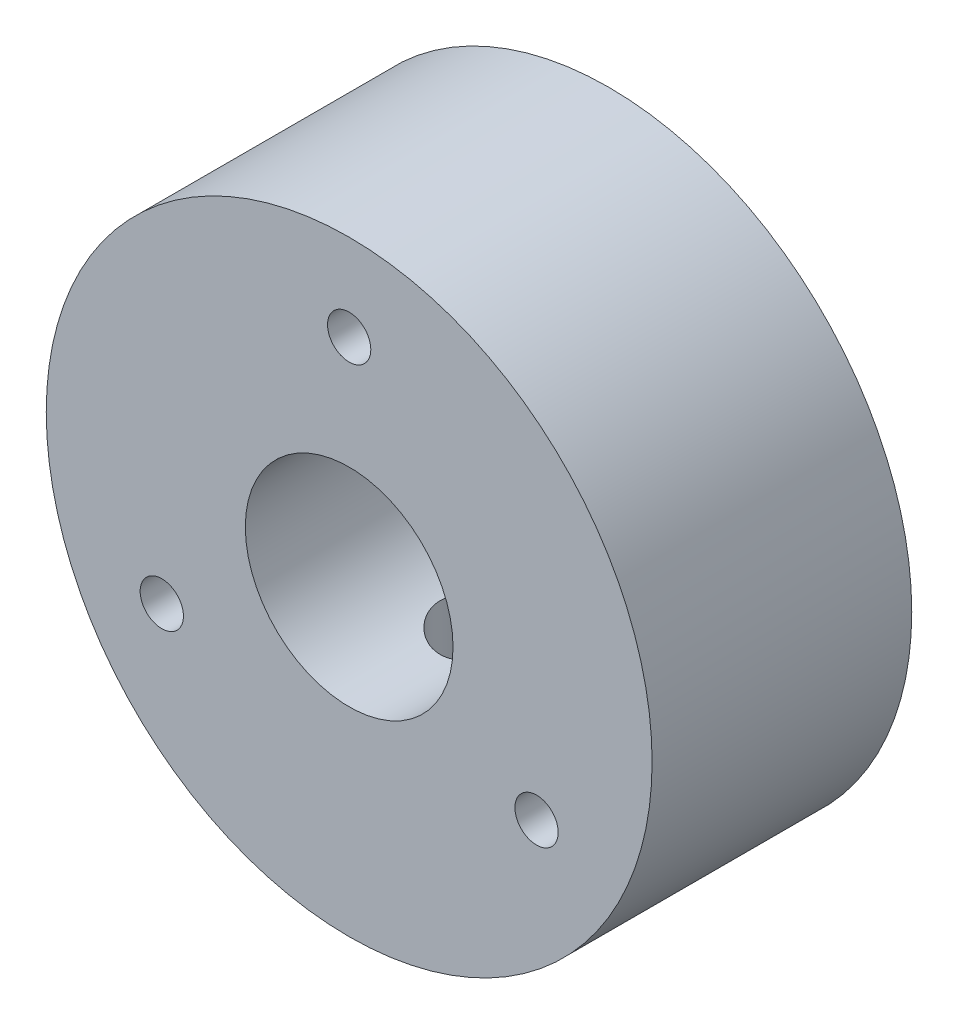
ISO-10303-21;
HEADER;
FILE_DESCRIPTION(('STEP AP214'),'2;1');
FILE_NAME('part.step','',(''),(''),'','','');
FILE_SCHEMA(('AUTOMOTIVE_DESIGN { 1 0 10303 214 1 1 1 1 }'));
ENDSEC;
DATA;
#1=APPLICATION_CONTEXT('core data for automotive mechanical design processes');
#2=APPLICATION_PROTOCOL_DEFINITION('international standard','automotive_design',2000,#1);
#3=PRODUCT_CONTEXT('',#1,'mechanical');
#4=PRODUCT('Part','Part','',(#3));
#5=PRODUCT_RELATED_PRODUCT_CATEGORY('part','',(#4));
#6=PRODUCT_DEFINITION_FORMATION('','',#4);
#7=PRODUCT_DEFINITION_CONTEXT('part definition',#1,'design');
#8=PRODUCT_DEFINITION('design','',#6,#7);
#9=PRODUCT_DEFINITION_SHAPE('','',#8);
#10=(LENGTH_UNIT() NAMED_UNIT(*) SI_UNIT(.MILLI.,.METRE.));
#11=(NAMED_UNIT(*) PLANE_ANGLE_UNIT() SI_UNIT($,.RADIAN.));
#12=(NAMED_UNIT(*) SI_UNIT($,.STERADIAN.) SOLID_ANGLE_UNIT());
#13=UNCERTAINTY_MEASURE_WITH_UNIT(LENGTH_MEASURE(1.E-05),#10,'distance_accuracy_value','');
#14=(GEOMETRIC_REPRESENTATION_CONTEXT(3) GLOBAL_UNCERTAINTY_ASSIGNED_CONTEXT((#13)) GLOBAL_UNIT_ASSIGNED_CONTEXT((#10,
#11,#12)) REPRESENTATION_CONTEXT('',''));
#15=CARTESIAN_POINT('',(0.,0.,0.));
#16=DIRECTION('',(0.,0.,1.));
#17=DIRECTION('',(1.,0.,0.));
#18=AXIS2_PLACEMENT_3D('',#15,#16,#17);
#19=CARTESIAN_POINT('',(0.,0.,15.));
#20=DIRECTION('',(0.,0.,1.));
#21=DIRECTION('',(1.,0.,0.));
#22=AXIS2_PLACEMENT_3D('',#19,#20,#21);
#23=PLANE('',#22);
#24=CARTESIAN_POINT('',(-10.8253175473055,-6.25000000000005,15.));
#25=DIRECTION('',(0.,0.,1.));
#26=DIRECTION('',(1.,0.,0.));
#27=AXIS2_PLACEMENT_3D('',#24,#25,#26);
#28=CIRCLE('',#27,1.25);
#29=CARTESIAN_POINT('',(-9.57531754730546,-6.25000000000005,15.));
#30=VERTEX_POINT('',#29);
#31=EDGE_CURVE('E111',#30,#30,#28,.T.);
#32=ORIENTED_EDGE('',*,*,#31,.F.);
#33=EDGE_LOOP('',(#32));
#34=FACE_BOUND('',#33,.T.);
#35=CARTESIAN_POINT('',(10.8253175473055,-6.25000000000005,15.));
#36=DIRECTION('',(0.,0.,1.));
#37=DIRECTION('',(1.,0.,0.));
#38=AXIS2_PLACEMENT_3D('',#35,#36,#37);
#39=CIRCLE('',#38,1.25);
#40=CARTESIAN_POINT('',(12.0753175473055,-6.25000000000005,15.));
#41=VERTEX_POINT('',#40);
#42=EDGE_CURVE('E107',#41,#41,#39,.T.);
#43=ORIENTED_EDGE('',*,*,#42,.F.);
#44=EDGE_LOOP('',(#43));
#45=FACE_BOUND('',#44,.T.);
#46=CARTESIAN_POINT('',(0.,12.5,15.));
#47=DIRECTION('',(0.,0.,1.));
#48=DIRECTION('',(1.,0.,0.));
#49=AXIS2_PLACEMENT_3D('',#46,#47,#48);
#50=CIRCLE('',#49,1.25);
#51=CARTESIAN_POINT('',(1.25,12.5,15.));
#52=VERTEX_POINT('',#51);
#53=EDGE_CURVE('E62',#52,#52,#50,.T.);
#54=ORIENTED_EDGE('',*,*,#53,.F.);
#55=EDGE_LOOP('',(#54));
#56=FACE_BOUND('',#55,.T.);
#57=CARTESIAN_POINT('',(0.,0.,15.));
#58=DIRECTION('',(0.,0.,1.));
#59=DIRECTION('',(1.,0.,0.));
#60=AXIS2_PLACEMENT_3D('',#57,#58,#59);
#61=CIRCLE('',#60,17.5);
#62=CARTESIAN_POINT('',(17.5,0.,15.));
#63=VERTEX_POINT('',#62);
#64=EDGE_CURVE('E10',#63,#63,#61,.T.);
#65=ORIENTED_EDGE('',*,*,#64,.T.);
#66=EDGE_LOOP('',(#65));
#67=FACE_BOUND('',#66,.T.);
#68=CARTESIAN_POINT('',(0.,0.,15.));
#69=DIRECTION('',(0.,0.,1.));
#70=DIRECTION('',(1.,0.,0.));
#71=AXIS2_PLACEMENT_3D('',#68,#69,#70);
#72=CIRCLE('',#71,6.);
#73=CARTESIAN_POINT('',(6.,0.,15.));
#74=VERTEX_POINT('',#73);
#75=EDGE_CURVE('E50',#74,#74,#72,.T.);
#76=ORIENTED_EDGE('',*,*,#75,.F.);
#77=EDGE_LOOP('',(#76));
#78=FACE_BOUND('',#77,.T.);
#79=ADVANCED_FACE('F32',(#34,#45,#56,#67,#78),#23,.T.);
#80=CARTESIAN_POINT('',(0.,0.,0.));
#81=DIRECTION('',(0.,0.,1.));
#82=DIRECTION('',(1.,0.,0.));
#83=AXIS2_PLACEMENT_3D('',#80,#81,#82);
#84=PLANE('',#83);
#85=CARTESIAN_POINT('',(-10.8253175473055,-6.25000000000005,0.));
#86=DIRECTION('',(0.,0.,1.));
#87=DIRECTION('',(1.,0.,0.));
#88=AXIS2_PLACEMENT_3D('',#85,#86,#87);
#89=CIRCLE('',#88,1.25);
#90=CARTESIAN_POINT('',(-9.57531754730546,-6.25000000000005,0.));
#91=VERTEX_POINT('',#90);
#92=EDGE_CURVE('E89',#91,#91,#89,.T.);
#93=ORIENTED_EDGE('',*,*,#92,.T.);
#94=EDGE_LOOP('',(#93));
#95=FACE_BOUND('',#94,.T.);
#96=CARTESIAN_POINT('',(10.8253175473055,-6.25000000000005,0.));
#97=DIRECTION('',(0.,0.,1.));
#98=DIRECTION('',(1.,0.,0.));
#99=AXIS2_PLACEMENT_3D('',#96,#97,#98);
#100=CIRCLE('',#99,1.25);
#101=CARTESIAN_POINT('',(12.0753175473055,-6.25000000000005,0.));
#102=VERTEX_POINT('',#101);
#103=EDGE_CURVE('E93',#102,#102,#100,.T.);
#104=ORIENTED_EDGE('',*,*,#103,.T.);
#105=EDGE_LOOP('',(#104));
#106=FACE_BOUND('',#105,.T.);
#107=CARTESIAN_POINT('',(0.,12.5,0.));
#108=DIRECTION('',(0.,0.,1.));
#109=DIRECTION('',(1.,0.,0.));
#110=AXIS2_PLACEMENT_3D('',#107,#108,#109);
#111=CIRCLE('',#110,1.25);
#112=CARTESIAN_POINT('',(1.25,12.5,0.));
#113=VERTEX_POINT('',#112);
#114=EDGE_CURVE('E97',#113,#113,#111,.T.);
#115=ORIENTED_EDGE('',*,*,#114,.T.);
#116=EDGE_LOOP('',(#115));
#117=FACE_BOUND('',#116,.T.);
#118=CARTESIAN_POINT('',(0.,0.,0.));
#119=DIRECTION('',(0.,0.,1.));
#120=DIRECTION('',(1.,0.,0.));
#121=AXIS2_PLACEMENT_3D('',#118,#119,#120);
#122=CIRCLE('',#121,17.5);
#123=CARTESIAN_POINT('',(17.5,0.,0.));
#124=VERTEX_POINT('',#123);
#125=EDGE_CURVE('E45',#124,#124,#122,.T.);
#126=ORIENTED_EDGE('',*,*,#125,.F.);
#127=EDGE_LOOP('',(#126));
#128=FACE_BOUND('',#127,.T.);
#129=CARTESIAN_POINT('',(0.,0.,0.));
#130=DIRECTION('',(0.,0.,1.));
#131=DIRECTION('',(1.,0.,0.));
#132=AXIS2_PLACEMENT_3D('',#129,#130,#131);
#133=CIRCLE('',#132,6.);
#134=CARTESIAN_POINT('',(6.,0.,0.));
#135=VERTEX_POINT('',#134);
#136=EDGE_CURVE('E52',#135,#135,#133,.T.);
#137=ORIENTED_EDGE('',*,*,#136,.T.);
#138=EDGE_LOOP('',(#137));
#139=FACE_BOUND('',#138,.T.);
#140=ADVANCED_FACE('F78',(#95,#106,#117,#128,#139),#84,.F.);
#141=CARTESIAN_POINT('',(0.,0.,15.));
#142=DIRECTION('',(0.,0.,-1.));
#143=DIRECTION('',(-1.,0.,0.));
#144=AXIS2_PLACEMENT_3D('',#141,#142,#143);
#145=CYLINDRICAL_SURFACE('',#144,17.5);
#146=CARTESIAN_POINT('',(0.,-17.5,9.75));
#147=CARTESIAN_POINT('',(0.125826663936366,-17.4999982039746,9.74999467313289));
#148=CARTESIAN_POINT('',(0.251731216440566,-17.4986286238282,9.73940950656838));
#149=CARTESIAN_POINT('',(0.500034753044219,-17.4932968449871,9.69735147156739));
#150=CARTESIAN_POINT('',(0.622429972446625,-17.4893319633254,9.66585698704675));
#151=CARTESIAN_POINT('',(0.860084357918169,-17.4792561017121,9.58292534146376));
#152=CARTESIAN_POINT('',(0.975348343355449,-17.4731465901793,9.53150182322499));
#153=CARTESIAN_POINT('',(1.19558918170756,-17.4594603874971,9.41020215621672));
#154=CARTESIAN_POINT('',(1.30056775056614,-17.4518839417102,9.34032909264626));
#155=CARTESIAN_POINT('',(1.49788912137822,-17.436060101576,9.1836799241711));
#156=CARTESIAN_POINT('',(1.59016353539961,-17.4278094299233,9.09681799746965));
#157=CARTESIAN_POINT('',(1.75886814148906,-17.411593361226,8.90884113611375));
#158=CARTESIAN_POINT('',(1.83529751303625,-17.4036279789724,8.80772546379755));
#159=CARTESIAN_POINT('',(1.97039882112328,-17.3888521797531,8.59366488477999));
#160=CARTESIAN_POINT('',(2.02900639424164,-17.3820459872199,8.48067903927697));
#161=CARTESIAN_POINT('',(2.12638937605627,-17.3704026461082,8.24636641244742));
#162=CARTESIAN_POINT('',(2.16516557959415,-17.3655654186153,8.12503996563344));
#163=CARTESIAN_POINT('',(2.2215766532938,-17.3584391389484,7.87820131927238));
#164=CARTESIAN_POINT('',(2.23932723266545,-17.3561361452853,7.75271597279249));
#165=CARTESIAN_POINT('',(2.25354128293598,-17.3542964728331,7.50052798394896));
#166=CARTESIAN_POINT('',(2.25000565786455,-17.354759676563,7.37382539351011));
#167=CARTESIAN_POINT('',(2.2218425893275,-17.3583873045897,7.12360737624315));
#168=CARTESIAN_POINT('',(2.1973427893762,-17.3615353812536,7.00007731186237));
#169=CARTESIAN_POINT('',(2.12814607218483,-17.3701525439387,6.75889645611996));
#170=CARTESIAN_POINT('',(2.08344872409567,-17.3756216794719,6.64124579023567));
#171=CARTESIAN_POINT('',(1.97498909627775,-17.3882831989435,6.41476794546454));
#172=CARTESIAN_POINT('',(1.91117153394893,-17.3954805676052,6.30596753131592));
#173=CARTESIAN_POINT('',(1.76632254764974,-17.4107837721729,6.10057198509021));
#174=CARTESIAN_POINT('',(1.68529029094895,-17.4188896520175,6.00397744381127));
#175=CARTESIAN_POINT('',(1.50760560937748,-17.4351691635329,5.82499486766366));
#176=CARTESIAN_POINT('',(1.41084319849627,-17.4433428568559,5.74271598750824));
#177=CARTESIAN_POINT('',(1.20482312504764,-17.4587815726166,5.59555085947799));
#178=CARTESIAN_POINT('',(1.09556543075004,-17.4660465927467,5.53066465577105));
#179=CARTESIAN_POINT('',(0.86757066076063,-17.4788542752852,5.42012595379627));
#180=CARTESIAN_POINT('',(0.748830132356868,-17.4843963067247,5.37448049943663));
#181=CARTESIAN_POINT('',(0.505282627641302,-17.493127922252,5.30380673993336));
#182=CARTESIAN_POINT('',(0.380475952227639,-17.4963176228956,5.27877741327418));
#183=CARTESIAN_POINT('',(0.129282531728022,-17.4999699961471,5.25018835711036));
#184=CARTESIAN_POINT('',(0.00291316244096512,-17.5004517623405,5.2464783017411));
#185=CARTESIAN_POINT('',(-0.248645576148053,-17.4986855924701,5.26023608738568));
#186=CARTESIAN_POINT('',(-0.373834972006372,-17.4964377179879,5.27770345063033));
#187=CARTESIAN_POINT('',(-0.619034977216093,-17.4894767245035,5.33319533754241));
#188=CARTESIAN_POINT('',(-0.739062120422699,-17.484772227773,5.37114797740577));
#189=CARTESIAN_POINT('',(-0.971048317067566,-17.4734245548944,5.46645820512669));
#190=CARTESIAN_POINT('',(-1.08300708201003,-17.4667813094664,5.52381648644209));
#191=CARTESIAN_POINT('',(-1.2963484276738,-17.4522488584435,5.65667204944307));
#192=CARTESIAN_POINT('',(-1.39767015153902,-17.4443530705122,5.7322663234421));
#193=CARTESIAN_POINT('',(-1.58624160153369,-17.4282188257375,5.899311100636));
#194=CARTESIAN_POINT('',(-1.6734907351305,-17.4199803544836,5.99076227115628));
#195=CARTESIAN_POINT('',(-1.83197548670832,-17.4040301413668,6.18758801091373));
#196=CARTESIAN_POINT('',(-1.90311130479669,-17.3963218776594,6.29304326253017));
#197=CARTESIAN_POINT('',(-2.02666012522735,-17.3823626363457,6.51449316700576));
#198=CARTESIAN_POINT('',(-2.07907352108845,-17.3761116281109,6.63048759828198));
#199=CARTESIAN_POINT('',(-2.16352900434716,-17.3657985633946,6.86940442651756));
#200=CARTESIAN_POINT('',(-2.19562686267363,-17.3617305188836,6.9923068392753));
#201=CARTESIAN_POINT('',(-2.23871947697181,-17.3562269753765,7.24181292188494));
#202=CARTESIAN_POINT('',(-2.24971527632875,-17.3547913462215,7.36841640842404));
#203=CARTESIAN_POINT('',(-2.25027174771641,-17.3547191199926,7.6207377348031));
#204=CARTESIAN_POINT('',(-2.2399892216588,-17.3560620474708,7.74645525168402));
#205=CARTESIAN_POINT('',(-2.19861349491162,-17.3613515363724,7.9943591140357));
#206=CARTESIAN_POINT('',(-2.16752029608453,-17.3652980975629,8.11654545982249));
#207=CARTESIAN_POINT('',(-2.08545574484551,-17.3753437330908,8.35389488133668));
#208=CARTESIAN_POINT('',(-2.03449240218651,-17.3814419399952,8.46906076544312));
#209=CARTESIAN_POINT('',(-1.91414964020136,-17.395105129023,8.68923162001525));
#210=CARTESIAN_POINT('',(-1.84476993740489,-17.4026701337232,8.79423643404464));
#211=CARTESIAN_POINT('',(-1.68898364486348,-17.418481278622,8.99190541591187));
#212=CARTESIAN_POINT('',(-1.60246026563941,-17.4267318519225,9.08447719241467));
#213=CARTESIAN_POINT('',(-1.41508708000806,-17.4429456345148,9.25384694055298));
#214=CARTESIAN_POINT('',(-1.31423390790498,-17.4509087757437,9.3306411960649));
#215=CARTESIAN_POINT('',(-1.10059707139096,-17.4656860103068,9.46654086974623));
#216=CARTESIAN_POINT('',(-0.987767090375414,-17.4724953573241,9.52557396105329));
#217=CARTESIAN_POINT('',(-0.753769111421519,-17.4841499591708,9.62376956694677));
#218=CARTESIAN_POINT('',(-0.632610279401129,-17.4889973339223,9.66295354019952));
#219=CARTESIAN_POINT('',(-0.425695928028328,-17.4950214329663,9.71102336497211));
#220=CARTESIAN_POINT('',(-0.34124186068432,-17.4968792358005,9.72561842400604));
#221=CARTESIAN_POINT('',(-0.17120387768221,-17.4993691254953,9.74510851523243));
#222=CARTESIAN_POINT('',(-0.085619971032625,-17.5000012221229,9.75000362471827));
#223=CARTESIAN_POINT('',(0.,-17.5,9.75));
#224=B_SPLINE_CURVE_WITH_KNOTS('',3,(#146,#147,#148,#149,#150,#151,#152,#153,#154,#155,#156,
#157,#158,#159,#160,#161,#162,#163,#164,#165,#166,#167,#168,#169,#170,#171,#172,#173,#174,#175,
#176,#177,#178,#179,#180,#181,#182,#183,#184,#185,#186,#187,#188,#189,#190,#191,#192,#193,#194,
#195,#196,#197,#198,#199,#200,#201,#202,#203,#204,#205,#206,#207,#208,#209,#210,#211,#212,#213,
#214,#215,#216,#217,#218,#219,#220,#221,#222,#223),.UNSPECIFIED.,.T.,.F.,(4,2,2,2,2,2,2,2,2,2,2,
2,2,2,2,2,2,2,2,2,2,2,2,2,2,2,2,2,2,2,2,2,2,2,2,2,2,2,4),(0.,0.377167233438936,
0.754724991353796,1.13202473972153,1.50926143458825,1.88845545438443,2.26766910549003,
2.6482364518246,3.02878854381839,3.40723648686338,3.78566835725604,4.16181235141834,
4.53796436977003,4.91521463413526,5.29248315147272,5.67251296808475,6.05254374975542,
6.43271353754735,6.81286448704356,7.19033160575359,7.56779020884563,7.94393282192944,
8.32008887783585,8.69829151453845,9.07651007147552,9.45701074759483,9.8375034256575,
10.2169469787706,10.5963717699229,10.9730105043799,11.3496492051289,11.7261362376708,
12.1026290655542,12.4817808194563,12.8610217739104,13.2417867945198,13.6221392909514,
13.878788429689,14.1354355233275),.UNSPECIFIED.);
#225=CARTESIAN_POINT('',(0.,-17.5,9.75));
#226=VERTEX_POINT('',#225);
#227=EDGE_CURVE('E55',#226,#226,#224,.T.);
#228=ORIENTED_EDGE('',*,*,#227,.T.);
#229=EDGE_LOOP('',(#228));
#230=FACE_BOUND('',#229,.T.);
#231=ORIENTED_EDGE('',*,*,#64,.F.);
#232=EDGE_LOOP('',(#231));
#233=FACE_BOUND('',#232,.T.);
#234=ORIENTED_EDGE('',*,*,#125,.T.);
#235=EDGE_LOOP('',(#234));
#236=FACE_BOUND('',#235,.T.);
#237=ADVANCED_FACE('F34',(#230,#233,#236),#145,.T.);
#238=CARTESIAN_POINT('',(0.,0.,15.));
#239=DIRECTION('',(0.,0.,-1.));
#240=DIRECTION('',(-1.,0.,0.));
#241=AXIS2_PLACEMENT_3D('',#238,#239,#240);
#242=CYLINDRICAL_SURFACE('',#241,6.);
#243=CARTESIAN_POINT('',(0.,-6.,9.75));
#244=CARTESIAN_POINT('',(0.12185258840678,-6.00000326184227,9.75000435345467));
#245=CARTESIAN_POINT('',(0.243675362672689,-5.99625568924776,9.74007035962743));
#246=CARTESIAN_POINT('',(0.483680178528542,-5.98168044010391,9.70075770709511));
#247=CARTESIAN_POINT('',(0.601862741981424,-5.9708537834099,9.67138184929415));
#248=CARTESIAN_POINT('',(0.831091177486319,-5.94328248587317,9.59437049734236));
#249=CARTESIAN_POINT('',(0.942150336243417,-5.9265492652416,9.54677022476732));
#250=CARTESIAN_POINT('',(1.15469896524038,-5.8888315164803,9.43484038047627));
#251=CARTESIAN_POINT('',(1.25618585876682,-5.86784584841321,9.37050632168376));
#252=CARTESIAN_POINT('',(1.45101962556874,-5.82279370456825,9.22408120339364));
#253=CARTESIAN_POINT('',(1.54390609522679,-5.79864003875349,9.1414046066109));
#254=CARTESIAN_POINT('',(1.71486632211545,-5.7504033130699,8.96188434801174));
#255=CARTESIAN_POINT('',(1.79293554538804,-5.72632027702549,8.86503636586819));
#256=CARTESIAN_POINT('',(1.93497303323978,-5.67993705926597,8.65542379871519));
#257=CARTESIAN_POINT('',(1.9982908979364,-5.65773973231228,8.54219345018127));
#258=CARTESIAN_POINT('',(2.10477969501127,-5.6189979035615,8.30572746874721));
#259=CARTESIAN_POINT('',(2.14795867441859,-5.60245114463822,8.18249585526735));
#260=CARTESIAN_POINT('',(2.21112646526324,-5.57781619236204,7.9348248896127));
#261=CARTESIAN_POINT('',(2.23199389827837,-5.56940886526257,7.81064244234684));
#262=CARTESIAN_POINT('',(2.25269334797472,-5.56107092191822,7.56027576300924));
#263=CARTESIAN_POINT('',(2.25253405203946,-5.56113680488957,7.43409237918829));
#264=CARTESIAN_POINT('',(2.23185644415027,-5.56946267448082,7.19134571218056));
#265=CARTESIAN_POINT('',(2.21255712763505,-5.57723203306682,7.07465864093373));
#266=CARTESIAN_POINT('',(2.15616251802495,-5.59927407089294,6.84631927439202));
#267=CARTESIAN_POINT('',(2.11906454494888,-5.61354772948295,6.73466774007918));
#268=CARTESIAN_POINT('',(2.02745622857856,-5.64728553285379,6.51708439840765));
#269=CARTESIAN_POINT('',(1.97262973105651,-5.66684276982249,6.41130077081805));
#270=CARTESIAN_POINT('',(1.84734110644047,-5.70891315208979,6.21008139361354));
#271=CARTESIAN_POINT('',(1.77687358093345,-5.73142731685737,6.11464923372045));
#272=CARTESIAN_POINT('',(1.61672671149823,-5.7787205828867,5.93009450452368));
#273=CARTESIAN_POINT('',(1.52607448075433,-5.80355021183506,5.84182703887786));
#274=CARTESIAN_POINT('',(1.33096888622853,-5.85137592246128,5.6814930506913));
#275=CARTESIAN_POINT('',(1.22651340524605,-5.87437172198928,5.60942901809149));
#276=CARTESIAN_POINT('',(1.00458515548863,-5.9163959221362,5.48260440440622));
#277=CARTESIAN_POINT('',(0.88693607076708,-5.93535747389424,5.42812862816841));
#278=CARTESIAN_POINT('',(0.643255275786876,-5.96668077490443,5.34002609359494));
#279=CARTESIAN_POINT('',(0.517227316268653,-5.9790454551224,5.30639007515832));
#280=CARTESIAN_POINT('',(0.267562864722999,-5.99526664842098,5.26256581868709));
#281=CARTESIAN_POINT('',(0.144155429343316,-5.99954053538529,5.25122609042623));
#282=CARTESIAN_POINT('',(-0.102858712882535,-6.00038840550189,5.24896340415012));
#283=CARTESIAN_POINT('',(-0.226465369475058,-5.99696409580295,5.25803591952483));
#284=CARTESIAN_POINT('',(-0.465393072842787,-5.98307564658965,5.295465063463));
#285=CARTESIAN_POINT('',(-0.580849992011002,-5.97288706443457,5.32306731560563));
#286=CARTESIAN_POINT('',(-0.805412632435829,-5.94677215637576,5.39577910882098));
#287=CARTESIAN_POINT('',(-0.9145175255213,-5.93084508423045,5.44089092692205));
#288=CARTESIAN_POINT('',(-1.12687164766523,-5.89424436611522,5.54877961865921));
#289=CARTESIAN_POINT('',(-1.22985462533669,-5.87344500314022,5.61203659383508));
#290=CARTESIAN_POINT('',(-1.42408906758994,-5.82940007346996,5.75387715475734));
#291=CARTESIAN_POINT('',(-1.51533618040567,-5.80615360514274,5.83246639881773));
#292=CARTESIAN_POINT('',(-1.68904619811681,-5.75809994236484,6.00810618318641));
#293=CARTESIAN_POINT('',(-1.77069231185353,-5.73328044755594,6.10596327415905));
#294=CARTESIAN_POINT('',(-1.91656575047855,-5.68618223620281,6.31447707706148));
#295=CARTESIAN_POINT('',(-1.98079151121777,-5.66390374791599,6.42513493708275));
#296=CARTESIAN_POINT('',(-2.09006660278496,-5.62450244733695,6.65702398015847));
#297=CARTESIAN_POINT('',(-2.13503528170377,-5.6074014049274,6.77829711886565));
#298=CARTESIAN_POINT('',(-2.20361825200333,-5.58081049336508,7.02751464553173));
#299=CARTESIAN_POINT('',(-2.22724575458302,-5.57131591586236,7.15545485429718));
#300=CARTESIAN_POINT('',(-2.25129520646758,-5.5616384218886,7.40552423931167));
#301=CARTESIAN_POINT('',(-2.25310997243756,-5.56089666785012,7.52749894757533));
#302=CARTESIAN_POINT('',(-2.23705073462389,-5.56737619117938,7.76991797441425));
#303=CARTESIAN_POINT('',(-2.21917859775185,-5.57459671348348,7.89036243700737));
#304=CARTESIAN_POINT('',(-2.16533723445362,-5.59572212378149,8.12257084007483));
#305=CARTESIAN_POINT('',(-2.12993697474786,-5.60941628064994,8.23448751936801));
#306=CARTESIAN_POINT('',(-2.04254545169879,-5.64182322446767,8.45085826274163));
#307=CARTESIAN_POINT('',(-1.99054999417417,-5.66053727992822,8.55531043210521));
#308=CARTESIAN_POINT('',(-1.86828113907231,-5.70209585855947,8.75974018454645));
#309=CARTESIAN_POINT('',(-1.79719249204515,-5.72510547661446,8.85919619519986));
#310=CARTESIAN_POINT('',(-1.64001728594859,-5.77209370135766,9.0452123414568));
#311=CARTESIAN_POINT('',(-1.55392596019212,-5.79607261414718,9.13176836218013));
#312=CARTESIAN_POINT('',(-1.36362059517693,-5.84385636914822,9.29430293373276));
#313=CARTESIAN_POINT('',(-1.25867796631949,-5.86758157350967,9.36945563015201));
#314=CARTESIAN_POINT('',(-1.03681983480123,-5.91081771685546,9.50103398291483));
#315=CARTESIAN_POINT('',(-0.919903401135933,-5.93032832777339,9.55745818160455));
#316=CARTESIAN_POINT('',(-0.671998623003468,-5.9636143891002,9.65156524357249));
#317=CARTESIAN_POINT('',(-0.540620133351313,-5.97710485737534,9.68833059690284));
#318=CARTESIAN_POINT('',(-0.272813600409573,-5.9952936326938,9.73753943988102));
#319=CARTESIAN_POINT('',(-0.136388124547288,-5.99999634905951,9.74999512723099));
#320=CARTESIAN_POINT('',(0.,-6.,9.75));
#321=B_SPLINE_CURVE_WITH_KNOTS('',3,(#243,#244,#245,#246,#247,#248,#249,#250,#251,#252,#253,
#254,#255,#256,#257,#258,#259,#260,#261,#262,#263,#264,#265,#266,#267,#268,#269,#270,#271,#272,
#273,#274,#275,#276,#277,#278,#279,#280,#281,#282,#283,#284,#285,#286,#287,#288,#289,#290,#291,
#292,#293,#294,#295,#296,#297,#298,#299,#300,#301,#302,#303,#304,#305,#306,#307,#308,#309,#310,
#311,#312,#313,#314,#315,#316,#317,#318,#319,#320),.UNSPECIFIED.,.T.,.F.,(4,2,2,2,2,2,2,2,2,2,2,
2,2,2,2,2,2,2,2,2,2,2,2,2,2,2,2,2,2,2,2,2,2,2,2,2,2,2,4),(0.,0.365054702340839,0.73005682429569,
1.09435705382036,1.45875506941423,1.83710427874073,2.21556907388432,2.60845011752488,
3.001174040282,3.37778811625352,3.75424659119561,4.10817517679957,4.46215707090883,
4.82283612580527,5.18363986116387,5.56869230003719,5.95380386857599,6.34487062929113,
6.73576349548268,7.10587529453888,7.4759050258578,7.8317165688576,8.1875743988168,
8.55388832789399,8.92033770029801,9.30804779183486,9.69579268380211,10.0851460009081,
10.4742581243476,10.8383814522038,11.2024702531689,11.555447136398,11.9085132998476,
12.2800870782641,12.6517791299559,13.0435849448106,13.4354212470765,13.8442277254806,
14.2528290269419),.UNSPECIFIED.);
#322=CARTESIAN_POINT('',(0.,-6.,9.75));
#323=VERTEX_POINT('',#322);
#324=EDGE_CURVE('E37',#323,#323,#321,.T.);
#325=ORIENTED_EDGE('',*,*,#324,.F.);
#326=EDGE_LOOP('',(#325));
#327=FACE_BOUND('',#326,.T.);
#328=ORIENTED_EDGE('',*,*,#75,.T.);
#329=EDGE_LOOP('',(#328));
#330=FACE_BOUND('',#329,.T.);
#331=ORIENTED_EDGE('',*,*,#136,.F.);
#332=EDGE_LOOP('',(#331));
#333=FACE_BOUND('',#332,.T.);
#334=ADVANCED_FACE('F69',(#327,#330,#333),#242,.F.);
#335=CARTESIAN_POINT('',(0.,-17.5,7.5));
#336=DIRECTION('',(0.,1.,0.));
#337=DIRECTION('',(0.,0.,1.));
#338=AXIS2_PLACEMENT_3D('',#335,#336,#337);
#339=CYLINDRICAL_SURFACE('',#338,2.25);
#340=ORIENTED_EDGE('',*,*,#324,.T.);
#341=EDGE_LOOP('',(#340));
#342=FACE_BOUND('',#341,.T.);
#343=ORIENTED_EDGE('',*,*,#227,.F.);
#344=EDGE_LOOP('',(#343));
#345=FACE_BOUND('',#344,.T.);
#346=ADVANCED_FACE('F64',(#342,#345),#339,.F.);
#347=CARTESIAN_POINT('',(0.,12.5,0.));
#348=DIRECTION('',(0.,0.,1.));
#349=DIRECTION('',(1.,0.,0.));
#350=AXIS2_PLACEMENT_3D('',#347,#348,#349);
#351=CYLINDRICAL_SURFACE('',#350,1.25);
#352=ORIENTED_EDGE('',*,*,#114,.F.);
#353=EDGE_LOOP('',(#352));
#354=FACE_BOUND('',#353,.T.);
#355=ORIENTED_EDGE('',*,*,#53,.T.);
#356=EDGE_LOOP('',(#355));
#357=FACE_BOUND('',#356,.T.);
#358=ADVANCED_FACE('F68',(#354,#357),#351,.F.);
#359=CARTESIAN_POINT('',(10.8253175473055,-6.25000000000005,0.));
#360=DIRECTION('',(0.,0.,1.));
#361=DIRECTION('',(1.,0.,0.));
#362=AXIS2_PLACEMENT_3D('',#359,#360,#361);
#363=CYLINDRICAL_SURFACE('',#362,1.25);
#364=ORIENTED_EDGE('',*,*,#103,.F.);
#365=EDGE_LOOP('',(#364));
#366=FACE_BOUND('',#365,.T.);
#367=ORIENTED_EDGE('',*,*,#42,.T.);
#368=EDGE_LOOP('',(#367));
#369=FACE_BOUND('',#368,.T.);
#370=ADVANCED_FACE('F126',(#366,#369),#363,.F.);
#371=CARTESIAN_POINT('',(-10.8253175473055,-6.25000000000005,0.));
#372=DIRECTION('',(0.,0.,1.));
#373=DIRECTION('',(1.,0.,0.));
#374=AXIS2_PLACEMENT_3D('',#371,#372,#373);
#375=CYLINDRICAL_SURFACE('',#374,1.25);
#376=ORIENTED_EDGE('',*,*,#92,.F.);
#377=EDGE_LOOP('',(#376));
#378=FACE_BOUND('',#377,.T.);
#379=ORIENTED_EDGE('',*,*,#31,.T.);
#380=EDGE_LOOP('',(#379));
#381=FACE_BOUND('',#380,.T.);
#382=ADVANCED_FACE('F116',(#378,#381),#375,.F.);
#383=CLOSED_SHELL('',(#79,#140,#237,#334,#346,#358,#370,#382));
#384=MANIFOLD_SOLID_BREP('B2',#383);
#385=ADVANCED_BREP_SHAPE_REPRESENTATION('',(#18,#384),#14);
#386=SHAPE_DEFINITION_REPRESENTATION(#9,#385);
ENDSEC;
END-ISO-10303-21;
